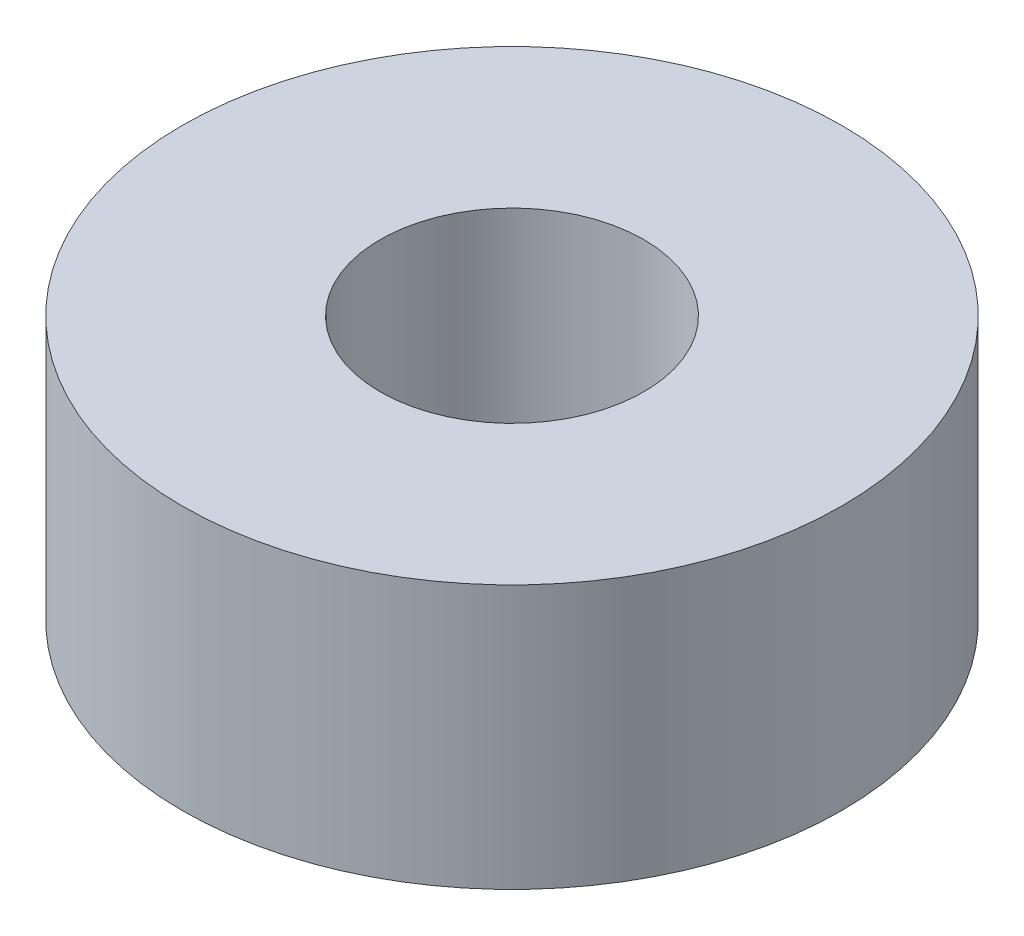
ISO-10303-21;
HEADER;
FILE_DESCRIPTION(('STEP AP214'),'2;1');
FILE_NAME('part.step','',(''),(''),'','','');
FILE_SCHEMA(('AUTOMOTIVE_DESIGN { 1 0 10303 214 1 1 1 1 }'));
ENDSEC;
DATA;
#1=APPLICATION_CONTEXT('core data for automotive mechanical design processes');
#2=APPLICATION_PROTOCOL_DEFINITION('international standard','automotive_design',2000,#1);
#3=PRODUCT_CONTEXT('',#1,'mechanical');
#4=PRODUCT('Part','Part','',(#3));
#5=PRODUCT_RELATED_PRODUCT_CATEGORY('part','',(#4));
#6=PRODUCT_DEFINITION_FORMATION('','',#4);
#7=PRODUCT_DEFINITION_CONTEXT('part definition',#1,'design');
#8=PRODUCT_DEFINITION('design','',#6,#7);
#9=PRODUCT_DEFINITION_SHAPE('','',#8);
#10=(LENGTH_UNIT() NAMED_UNIT(*) SI_UNIT(.MILLI.,.METRE.));
#11=(NAMED_UNIT(*) PLANE_ANGLE_UNIT() SI_UNIT($,.RADIAN.));
#12=(NAMED_UNIT(*) SI_UNIT($,.STERADIAN.) SOLID_ANGLE_UNIT());
#13=UNCERTAINTY_MEASURE_WITH_UNIT(LENGTH_MEASURE(1.E-05),#10,'distance_accuracy_value','');
#14=(GEOMETRIC_REPRESENTATION_CONTEXT(3) GLOBAL_UNCERTAINTY_ASSIGNED_CONTEXT((#13)) GLOBAL_UNIT_ASSIGNED_CONTEXT((#10,
#11,#12)) REPRESENTATION_CONTEXT('',''));
#15=CARTESIAN_POINT('',(0.,0.,0.));
#16=DIRECTION('',(0.,0.,1.));
#17=DIRECTION('',(1.,0.,0.));
#18=AXIS2_PLACEMENT_3D('',#15,#16,#17);
#19=CARTESIAN_POINT('',(0.,4.,0.));
#20=DIRECTION('',(0.,1.,0.));
#21=DIRECTION('',(0.,0.,1.));
#22=AXIS2_PLACEMENT_3D('',#19,#20,#21);
#23=PLANE('',#22);
#24=CARTESIAN_POINT('',(0.,4.,0.));
#25=DIRECTION('',(0.,1.,0.));
#26=DIRECTION('',(0.,0.,1.));
#27=AXIS2_PLACEMENT_3D('',#24,#25,#26);
#28=CIRCLE('',#27,5.);
#29=CARTESIAN_POINT('',(0.,4.,5.));
#30=VERTEX_POINT('',#29);
#31=EDGE_CURVE('E11',#30,#30,#28,.T.);
#32=ORIENTED_EDGE('',*,*,#31,.T.);
#33=EDGE_LOOP('',(#32));
#34=FACE_BOUND('',#33,.T.);
#35=CARTESIAN_POINT('',(0.,4.,0.));
#36=DIRECTION('',(0.,1.,0.));
#37=DIRECTION('',(0.,0.,1.));
#38=AXIS2_PLACEMENT_3D('',#35,#36,#37);
#39=CIRCLE('',#38,2.);
#40=CARTESIAN_POINT('',(0.,4.,2.));
#41=VERTEX_POINT('',#40);
#42=EDGE_CURVE('E55',#41,#41,#39,.T.);
#43=ORIENTED_EDGE('',*,*,#42,.F.);
#44=EDGE_LOOP('',(#43));
#45=FACE_BOUND('',#44,.T.);
#46=ADVANCED_FACE('F44',(#34,#45),#23,.T.);
#47=CARTESIAN_POINT('',(0.,0.,0.));
#48=DIRECTION('',(0.,1.,0.));
#49=DIRECTION('',(0.,0.,1.));
#50=AXIS2_PLACEMENT_3D('',#47,#48,#49);
#51=PLANE('',#50);
#52=CARTESIAN_POINT('',(0.,0.,0.));
#53=DIRECTION('',(0.,1.,0.));
#54=DIRECTION('',(0.,0.,1.));
#55=AXIS2_PLACEMENT_3D('',#52,#53,#54);
#56=CIRCLE('',#55,5.);
#57=CARTESIAN_POINT('',(0.,0.,5.));
#58=VERTEX_POINT('',#57);
#59=EDGE_CURVE('E48',#58,#58,#56,.T.);
#60=ORIENTED_EDGE('',*,*,#59,.F.);
#61=EDGE_LOOP('',(#60));
#62=FACE_BOUND('',#61,.T.);
#63=CARTESIAN_POINT('',(0.,0.,0.));
#64=DIRECTION('',(0.,1.,0.));
#65=DIRECTION('',(0.,0.,1.));
#66=AXIS2_PLACEMENT_3D('',#63,#64,#65);
#67=CIRCLE('',#66,2.);
#68=CARTESIAN_POINT('',(0.,0.,2.));
#69=VERTEX_POINT('',#68);
#70=EDGE_CURVE('E57',#69,#69,#67,.T.);
#71=ORIENTED_EDGE('',*,*,#70,.T.);
#72=EDGE_LOOP('',(#71));
#73=FACE_BOUND('',#72,.T.);
#74=ADVANCED_FACE('F67',(#62,#73),#51,.F.);
#75=CARTESIAN_POINT('',(0.,4.,0.));
#76=DIRECTION('',(0.,-1.,0.));
#77=DIRECTION('',(0.,0.,-1.));
#78=AXIS2_PLACEMENT_3D('',#75,#76,#77);
#79=CYLINDRICAL_SURFACE('',#78,5.);
#80=ORIENTED_EDGE('',*,*,#31,.F.);
#81=EDGE_LOOP('',(#80));
#82=FACE_BOUND('',#81,.T.);
#83=ORIENTED_EDGE('',*,*,#59,.T.);
#84=EDGE_LOOP('',(#83));
#85=FACE_BOUND('',#84,.T.);
#86=ADVANCED_FACE('F46',(#82,#85),#79,.T.);
#87=CARTESIAN_POINT('',(0.,4.,0.));
#88=DIRECTION('',(0.,-1.,0.));
#89=DIRECTION('',(0.,0.,-1.));
#90=AXIS2_PLACEMENT_3D('',#87,#88,#89);
#91=CYLINDRICAL_SURFACE('',#90,2.);
#92=ORIENTED_EDGE('',*,*,#42,.T.);
#93=EDGE_LOOP('',(#92));
#94=FACE_BOUND('',#93,.T.);
#95=ORIENTED_EDGE('',*,*,#70,.F.);
#96=EDGE_LOOP('',(#95));
#97=FACE_BOUND('',#96,.T.);
#98=ADVANCED_FACE('F63',(#94,#97),#91,.F.);
#99=CLOSED_SHELL('',(#46,#74,#86,#98));
#100=MANIFOLD_SOLID_BREP('B2',#99);
#101=ADVANCED_BREP_SHAPE_REPRESENTATION('',(#18,#100),#14);
#102=SHAPE_DEFINITION_REPRESENTATION(#9,#101);
ENDSEC;
END-ISO-10303-21;
